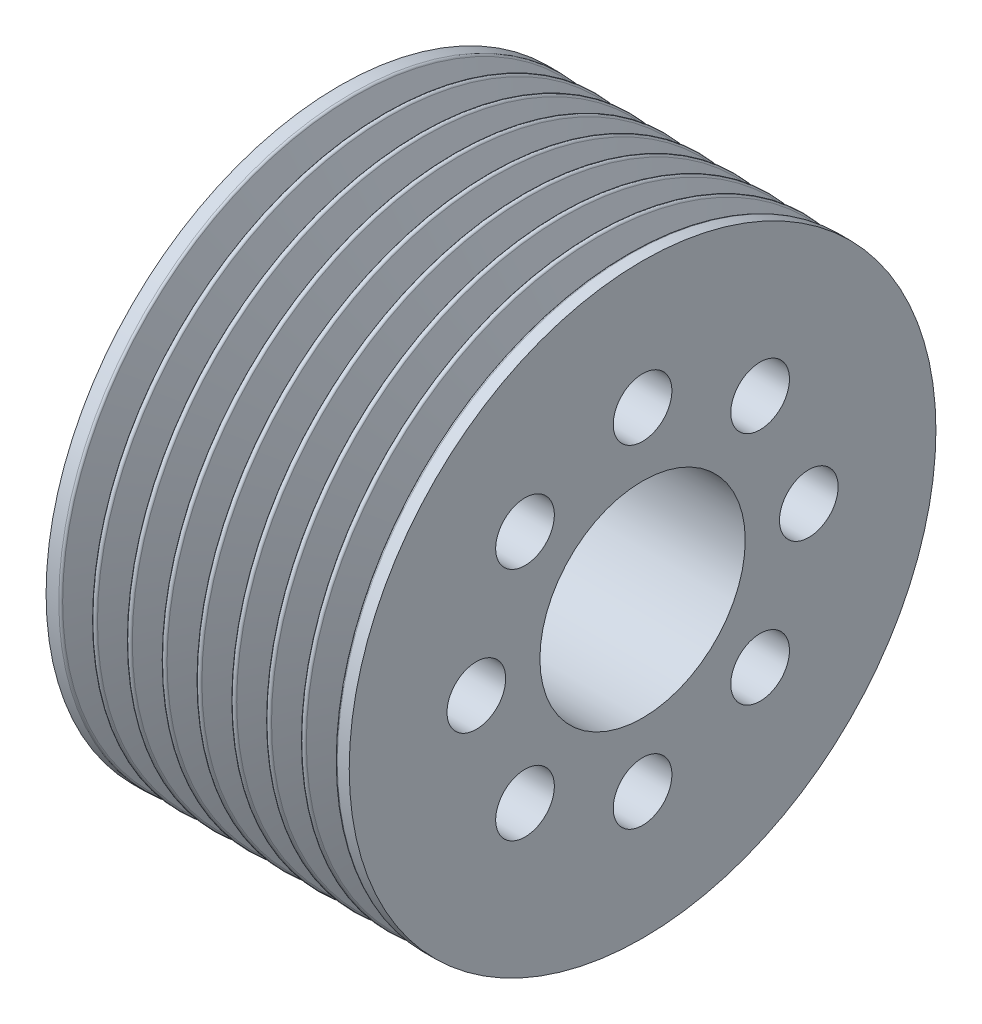
ISO-10303-21;
HEADER;
FILE_DESCRIPTION(('STEP AP214'),'2;1');
FILE_NAME('part.step','',(''),(''),'','','');
FILE_SCHEMA(('AUTOMOTIVE_DESIGN { 1 0 10303 214 1 1 1 1 }'));
ENDSEC;
DATA;
#1=APPLICATION_CONTEXT('core data for automotive mechanical design processes');
#2=APPLICATION_PROTOCOL_DEFINITION('international standard','automotive_design',2000,#1);
#3=PRODUCT_CONTEXT('',#1,'mechanical');
#4=PRODUCT('Part','Part','',(#3));
#5=PRODUCT_RELATED_PRODUCT_CATEGORY('part','',(#4));
#6=PRODUCT_DEFINITION_FORMATION('','',#4);
#7=PRODUCT_DEFINITION_CONTEXT('part definition',#1,'design');
#8=PRODUCT_DEFINITION('design','',#6,#7);
#9=PRODUCT_DEFINITION_SHAPE('','',#8);
#10=(LENGTH_UNIT() NAMED_UNIT(*) SI_UNIT(.MILLI.,.METRE.));
#11=(NAMED_UNIT(*) PLANE_ANGLE_UNIT() SI_UNIT($,.RADIAN.));
#12=(NAMED_UNIT(*) SI_UNIT($,.STERADIAN.) SOLID_ANGLE_UNIT());
#13=UNCERTAINTY_MEASURE_WITH_UNIT(LENGTH_MEASURE(1.E-05),#10,'distance_accuracy_value','');
#14=(GEOMETRIC_REPRESENTATION_CONTEXT(3) GLOBAL_UNCERTAINTY_ASSIGNED_CONTEXT((#13)) GLOBAL_UNIT_ASSIGNED_CONTEXT((#10,
#11,#12)) REPRESENTATION_CONTEXT('',''));
#15=CARTESIAN_POINT('',(0.,0.,0.));
#16=DIRECTION('',(0.,0.,1.));
#17=DIRECTION('',(1.,0.,0.));
#18=AXIS2_PLACEMENT_3D('',#15,#16,#17);
#19=CARTESIAN_POINT('',(0.,0.,0.));
#20=DIRECTION('',(-1.,0.,0.));
#21=DIRECTION('',(0.,0.,1.));
#22=AXIS2_PLACEMENT_3D('',#19,#20,#21);
#23=CYLINDRICAL_SURFACE('',#22,30.);
#24=CARTESIAN_POINT('',(18.,0.,0.));
#25=DIRECTION('',(-1.,0.,0.));
#26=DIRECTION('',(0.,0.,1.));
#27=AXIS2_PLACEMENT_3D('',#24,#25,#26);
#28=CIRCLE('',#27,30.);
#29=CARTESIAN_POINT('',(18.,0.,30.));
#30=VERTEX_POINT('',#29);
#31=EDGE_CURVE('E54',#30,#30,#28,.T.);
#32=ORIENTED_EDGE('',*,*,#31,.F.);
#33=EDGE_LOOP('',(#32));
#34=FACE_BOUND('',#33,.T.);
#35=CARTESIAN_POINT('',(19.3,0.,0.));
#36=DIRECTION('',(-1.,0.,0.));
#37=DIRECTION('',(0.,0.,1.));
#38=AXIS2_PLACEMENT_3D('',#35,#36,#37);
#39=CIRCLE('',#38,30.);
#40=CARTESIAN_POINT('',(19.3,0.,30.));
#41=VERTEX_POINT('',#40);
#42=EDGE_CURVE('E168',#41,#41,#39,.T.);
#43=ORIENTED_EDGE('',*,*,#42,.T.);
#44=EDGE_LOOP('',(#43));
#45=FACE_BOUND('',#44,.T.);
#46=ADVANCED_FACE('F42',(#34,#45),#23,.T.);
#47=CARTESIAN_POINT('',(31.5,10.5,0.));
#48=DIRECTION('',(1.,0.,0.));
#49=DIRECTION('',(0.,0.,-1.));
#50=AXIS2_PLACEMENT_3D('',#47,#48,#49);
#51=PLANE('',#50);
#52=CARTESIAN_POINT('',(31.5,12.0208152801713,12.0208152801713));
#53=DIRECTION('',(1.,0.,0.));
#54=DIRECTION('',(0.,0.,-1.));
#55=AXIS2_PLACEMENT_3D('',#52,#53,#54);
#56=CIRCLE('',#55,3.);
#57=CARTESIAN_POINT('',(31.5,12.0208152801713,9.02081528017131));
#58=VERTEX_POINT('',#57);
#59=EDGE_CURVE('E213',#58,#58,#56,.F.);
#60=ORIENTED_EDGE('',*,*,#59,.F.);
#61=EDGE_LOOP('',(#60));
#62=FACE_BOUND('',#61,.T.);
#63=CARTESIAN_POINT('',(31.5,-12.0208152801713,12.0208152801713));
#64=DIRECTION('',(1.,0.,0.));
#65=DIRECTION('',(0.,0.,-1.));
#66=AXIS2_PLACEMENT_3D('',#63,#64,#65);
#67=CIRCLE('',#66,3.);
#68=CARTESIAN_POINT('',(31.5,-12.0208152801713,9.02081528017133));
#69=VERTEX_POINT('',#68);
#70=EDGE_CURVE('E207',#69,#69,#67,.F.);
#71=ORIENTED_EDGE('',*,*,#70,.F.);
#72=EDGE_LOOP('',(#71));
#73=FACE_BOUND('',#72,.T.);
#74=CARTESIAN_POINT('',(31.5,-17.,-2.47198095326695E-13));
#75=DIRECTION('',(1.,0.,0.));
#76=DIRECTION('',(0.,0.,-1.));
#77=AXIS2_PLACEMENT_3D('',#74,#75,#76);
#78=CIRCLE('',#77,3.);
#79=CARTESIAN_POINT('',(31.5,-17.,-3.00000000000025));
#80=VERTEX_POINT('',#79);
#81=EDGE_CURVE('E201',#80,#80,#78,.F.);
#82=ORIENTED_EDGE('',*,*,#81,.F.);
#83=EDGE_LOOP('',(#82));
#84=FACE_BOUND('',#83,.T.);
#85=CARTESIAN_POINT('',(31.5,-12.020815280171,-12.0208152801716));
#86=DIRECTION('',(1.,0.,0.));
#87=DIRECTION('',(0.,0.,-1.));
#88=AXIS2_PLACEMENT_3D('',#85,#86,#87);
#89=CIRCLE('',#88,3.);
#90=CARTESIAN_POINT('',(31.5,-12.020815280171,-15.0208152801716));
#91=VERTEX_POINT('',#90);
#92=EDGE_CURVE('E195',#91,#91,#89,.F.);
#93=ORIENTED_EDGE('',*,*,#92,.F.);
#94=EDGE_LOOP('',(#93));
#95=FACE_BOUND('',#94,.T.);
#96=CARTESIAN_POINT('',(31.5,0.,-17.));
#97=DIRECTION('',(1.,0.,0.));
#98=DIRECTION('',(0.,0.,-1.));
#99=AXIS2_PLACEMENT_3D('',#96,#97,#98);
#100=CIRCLE('',#99,3.);
#101=CARTESIAN_POINT('',(31.5,0.,-20.));
#102=VERTEX_POINT('',#101);
#103=EDGE_CURVE('E189',#102,#102,#100,.F.);
#104=ORIENTED_EDGE('',*,*,#103,.F.);
#105=EDGE_LOOP('',(#104));
#106=FACE_BOUND('',#105,.T.);
#107=CARTESIAN_POINT('',(31.5,12.0208152801713,-12.0208152801713));
#108=DIRECTION('',(1.,0.,0.));
#109=DIRECTION('',(0.,0.,-1.));
#110=AXIS2_PLACEMENT_3D('',#107,#108,#109);
#111=CIRCLE('',#110,3.);
#112=CARTESIAN_POINT('',(31.5,12.0208152801713,-15.0208152801713));
#113=VERTEX_POINT('',#112);
#114=EDGE_CURVE('E183',#113,#113,#111,.F.);
#115=ORIENTED_EDGE('',*,*,#114,.F.);
#116=EDGE_LOOP('',(#115));
#117=FACE_BOUND('',#116,.T.);
#118=CARTESIAN_POINT('',(31.5,1.72382073893029E-13,17.));
#119=DIRECTION('',(1.,0.,0.));
#120=DIRECTION('',(0.,0.,-1.));
#121=AXIS2_PLACEMENT_3D('',#118,#119,#120);
#122=CIRCLE('',#121,3.);
#123=CARTESIAN_POINT('',(31.5,1.72382073893029E-13,14.));
#124=VERTEX_POINT('',#123);
#125=EDGE_CURVE('E177',#124,#124,#122,.F.);
#126=ORIENTED_EDGE('',*,*,#125,.F.);
#127=EDGE_LOOP('',(#126));
#128=FACE_BOUND('',#127,.T.);
#129=CARTESIAN_POINT('',(31.5,17.,0.));
#130=DIRECTION('',(1.,0.,0.));
#131=DIRECTION('',(0.,0.,-1.));
#132=AXIS2_PLACEMENT_3D('',#129,#130,#131);
#133=CIRCLE('',#132,3.);
#134=CARTESIAN_POINT('',(31.5,17.,-3.));
#135=VERTEX_POINT('',#134);
#136=EDGE_CURVE('E171',#135,#135,#133,.F.);
#137=ORIENTED_EDGE('',*,*,#136,.F.);
#138=EDGE_LOOP('',(#137));
#139=FACE_BOUND('',#138,.T.);
#140=CARTESIAN_POINT('',(31.5,0.,0.));
#141=DIRECTION('',(-1.,0.,0.));
#142=DIRECTION('',(0.,0.,1.));
#143=AXIS2_PLACEMENT_3D('',#140,#141,#142);
#144=CIRCLE('',#143,10.5);
#145=CARTESIAN_POINT('',(31.5,0.,10.5));
#146=VERTEX_POINT('',#145);
#147=EDGE_CURVE('E66',#146,#146,#144,.T.);
#148=ORIENTED_EDGE('',*,*,#147,.F.);
#149=EDGE_LOOP('',(#148));
#150=FACE_BOUND('',#149,.T.);
#151=CARTESIAN_POINT('',(31.5,0.,0.));
#152=DIRECTION('',(-1.,0.,0.));
#153=DIRECTION('',(0.,0.,1.));
#154=AXIS2_PLACEMENT_3D('',#151,#152,#153);
#155=CIRCLE('',#154,21.5);
#156=CARTESIAN_POINT('',(31.5,0.,21.5));
#157=VERTEX_POINT('',#156);
#158=EDGE_CURVE('E10',#157,#157,#155,.T.);
#159=ORIENTED_EDGE('',*,*,#158,.T.);
#160=EDGE_LOOP('',(#159));
#161=FACE_BOUND('',#160,.T.);
#162=ADVANCED_FACE('F45',(#62,#73,#84,#95,#106,#117,#128,#139,#150,#161),#51,.F.);
#163=CARTESIAN_POINT('',(0.,0.,0.));
#164=DIRECTION('',(-1.,0.,0.));
#165=DIRECTION('',(0.,0.,1.));
#166=AXIS2_PLACEMENT_3D('',#163,#164,#165);
#167=CYLINDRICAL_SURFACE('',#166,21.5);
#168=ORIENTED_EDGE('',*,*,#158,.F.);
#169=EDGE_LOOP('',(#168));
#170=FACE_BOUND('',#169,.T.);
#171=CARTESIAN_POINT('',(18.,0.,0.));
#172=DIRECTION('',(-1.,0.,0.));
#173=DIRECTION('',(0.,0.,1.));
#174=AXIS2_PLACEMENT_3D('',#171,#172,#173);
#175=CIRCLE('',#174,21.5);
#176=CARTESIAN_POINT('',(18.,0.,21.5));
#177=VERTEX_POINT('',#176);
#178=EDGE_CURVE('E50',#177,#177,#175,.T.);
#179=ORIENTED_EDGE('',*,*,#178,.T.);
#180=EDGE_LOOP('',(#179));
#181=FACE_BOUND('',#180,.T.);
#182=ADVANCED_FACE('F253',(#170,#181),#167,.F.);
#183=CARTESIAN_POINT('',(18.,30.,0.));
#184=DIRECTION('',(1.,0.,0.));
#185=DIRECTION('',(0.,0.,-1.));
#186=AXIS2_PLACEMENT_3D('',#183,#184,#185);
#187=PLANE('',#186);
#188=ORIENTED_EDGE('',*,*,#178,.F.);
#189=EDGE_LOOP('',(#188));
#190=FACE_BOUND('',#189,.T.);
#191=ORIENTED_EDGE('',*,*,#31,.T.);
#192=EDGE_LOOP('',(#191));
#193=FACE_BOUND('',#192,.T.);
#194=ADVANCED_FACE('F259',(#190,#193),#187,.F.);
#195=CARTESIAN_POINT('',(47.78,0.,0.));
#196=DIRECTION('',(-1.,0.,0.));
#197=DIRECTION('',(0.,0.,1.));
#198=AXIS2_PLACEMENT_3D('',#195,#196,#197);
#199=CIRCLE('',#198,30.);
#200=CARTESIAN_POINT('',(47.78,0.,30.));
#201=VERTEX_POINT('',#200);
#202=EDGE_CURVE('E81',#201,#201,#199,.T.);
#203=ORIENTED_EDGE('',*,*,#202,.F.);
#204=EDGE_LOOP('',(#203));
#205=FACE_BOUND('',#204,.T.);
#206=CARTESIAN_POINT('',(49.,0.,0.));
#207=DIRECTION('',(-1.,0.,0.));
#208=DIRECTION('',(0.,0.,1.));
#209=AXIS2_PLACEMENT_3D('',#206,#207,#208);
#210=CIRCLE('',#209,30.);
#211=CARTESIAN_POINT('',(49.,0.,30.));
#212=VERTEX_POINT('',#211);
#213=EDGE_CURVE('E58',#212,#212,#210,.T.);
#214=ORIENTED_EDGE('',*,*,#213,.T.);
#215=EDGE_LOOP('',(#214));
#216=FACE_BOUND('',#215,.T.);
#217=ADVANCED_FACE('F226',(#205,#216),#23,.T.);
#218=CARTESIAN_POINT('',(49.,10.5,0.));
#219=DIRECTION('',(-1.,0.,0.));
#220=DIRECTION('',(0.,0.,1.));
#221=AXIS2_PLACEMENT_3D('',#218,#219,#220);
#222=PLANE('',#221);
#223=CARTESIAN_POINT('',(49.,12.0208152801713,12.0208152801713));
#224=DIRECTION('',(1.,0.,0.));
#225=DIRECTION('',(0.,0.,-1.));
#226=AXIS2_PLACEMENT_3D('',#223,#224,#225);
#227=CIRCLE('',#226,3.);
#228=CARTESIAN_POINT('',(49.,12.0208152801713,9.02081528017131));
#229=VERTEX_POINT('',#228);
#230=EDGE_CURVE('E216',#229,#229,#227,.T.);
#231=ORIENTED_EDGE('',*,*,#230,.F.);
#232=EDGE_LOOP('',(#231));
#233=FACE_BOUND('',#232,.T.);
#234=CARTESIAN_POINT('',(49.,-12.0208152801713,12.0208152801713));
#235=DIRECTION('',(1.,0.,0.));
#236=DIRECTION('',(0.,0.,-1.));
#237=AXIS2_PLACEMENT_3D('',#234,#235,#236);
#238=CIRCLE('',#237,3.);
#239=CARTESIAN_POINT('',(49.,-12.0208152801713,9.02081528017133));
#240=VERTEX_POINT('',#239);
#241=EDGE_CURVE('E210',#240,#240,#238,.T.);
#242=ORIENTED_EDGE('',*,*,#241,.F.);
#243=EDGE_LOOP('',(#242));
#244=FACE_BOUND('',#243,.T.);
#245=CARTESIAN_POINT('',(49.,-17.,-2.47198095326695E-13));
#246=DIRECTION('',(1.,0.,0.));
#247=DIRECTION('',(0.,0.,-1.));
#248=AXIS2_PLACEMENT_3D('',#245,#246,#247);
#249=CIRCLE('',#248,3.);
#250=CARTESIAN_POINT('',(49.,-17.,-3.00000000000025));
#251=VERTEX_POINT('',#250);
#252=EDGE_CURVE('E204',#251,#251,#249,.T.);
#253=ORIENTED_EDGE('',*,*,#252,.F.);
#254=EDGE_LOOP('',(#253));
#255=FACE_BOUND('',#254,.T.);
#256=CARTESIAN_POINT('',(49.,-12.020815280171,-12.0208152801716));
#257=DIRECTION('',(1.,0.,0.));
#258=DIRECTION('',(0.,0.,-1.));
#259=AXIS2_PLACEMENT_3D('',#256,#257,#258);
#260=CIRCLE('',#259,3.);
#261=CARTESIAN_POINT('',(49.,-12.020815280171,-15.0208152801716));
#262=VERTEX_POINT('',#261);
#263=EDGE_CURVE('E198',#262,#262,#260,.T.);
#264=ORIENTED_EDGE('',*,*,#263,.F.);
#265=EDGE_LOOP('',(#264));
#266=FACE_BOUND('',#265,.T.);
#267=CARTESIAN_POINT('',(49.,0.,-17.));
#268=DIRECTION('',(1.,0.,0.));
#269=DIRECTION('',(0.,0.,-1.));
#270=AXIS2_PLACEMENT_3D('',#267,#268,#269);
#271=CIRCLE('',#270,3.);
#272=CARTESIAN_POINT('',(49.,0.,-20.));
#273=VERTEX_POINT('',#272);
#274=EDGE_CURVE('E192',#273,#273,#271,.T.);
#275=ORIENTED_EDGE('',*,*,#274,.F.);
#276=EDGE_LOOP('',(#275));
#277=FACE_BOUND('',#276,.T.);
#278=CARTESIAN_POINT('',(49.,12.0208152801713,-12.0208152801713));
#279=DIRECTION('',(1.,0.,0.));
#280=DIRECTION('',(0.,0.,-1.));
#281=AXIS2_PLACEMENT_3D('',#278,#279,#280);
#282=CIRCLE('',#281,3.);
#283=CARTESIAN_POINT('',(49.,12.0208152801713,-15.0208152801713));
#284=VERTEX_POINT('',#283);
#285=EDGE_CURVE('E186',#284,#284,#282,.T.);
#286=ORIENTED_EDGE('',*,*,#285,.F.);
#287=EDGE_LOOP('',(#286));
#288=FACE_BOUND('',#287,.T.);
#289=CARTESIAN_POINT('',(49.,1.72382073893029E-13,17.));
#290=DIRECTION('',(1.,0.,0.));
#291=DIRECTION('',(0.,0.,-1.));
#292=AXIS2_PLACEMENT_3D('',#289,#290,#291);
#293=CIRCLE('',#292,3.);
#294=CARTESIAN_POINT('',(49.,1.72382073893029E-13,14.));
#295=VERTEX_POINT('',#294);
#296=EDGE_CURVE('E180',#295,#295,#293,.T.);
#297=ORIENTED_EDGE('',*,*,#296,.F.);
#298=EDGE_LOOP('',(#297));
#299=FACE_BOUND('',#298,.T.);
#300=CARTESIAN_POINT('',(49.,17.,0.));
#301=DIRECTION('',(1.,0.,0.));
#302=DIRECTION('',(0.,0.,-1.));
#303=AXIS2_PLACEMENT_3D('',#300,#301,#302);
#304=CIRCLE('',#303,3.);
#305=CARTESIAN_POINT('',(49.,17.,-3.));
#306=VERTEX_POINT('',#305);
#307=EDGE_CURVE('E174',#306,#306,#304,.T.);
#308=ORIENTED_EDGE('',*,*,#307,.F.);
#309=EDGE_LOOP('',(#308));
#310=FACE_BOUND('',#309,.T.);
#311=ORIENTED_EDGE('',*,*,#213,.F.);
#312=EDGE_LOOP('',(#311));
#313=FACE_BOUND('',#312,.T.);
#314=CARTESIAN_POINT('',(49.,0.,0.));
#315=DIRECTION('',(-1.,0.,0.));
#316=DIRECTION('',(0.,0.,1.));
#317=AXIS2_PLACEMENT_3D('',#314,#315,#316);
#318=CIRCLE('',#317,10.5);
#319=CARTESIAN_POINT('',(49.,0.,10.5));
#320=VERTEX_POINT('',#319);
#321=EDGE_CURVE('E63',#320,#320,#318,.T.);
#322=ORIENTED_EDGE('',*,*,#321,.T.);
#323=EDGE_LOOP('',(#322));
#324=FACE_BOUND('',#323,.T.);
#325=ADVANCED_FACE('F222',(#233,#244,#255,#266,#277,#288,#299,#310,#313,#324),#222,.F.);
#326=CARTESIAN_POINT('',(0.,0.,0.));
#327=DIRECTION('',(-1.,0.,0.));
#328=DIRECTION('',(0.,0.,1.));
#329=AXIS2_PLACEMENT_3D('',#326,#327,#328);
#330=CYLINDRICAL_SURFACE('',#329,10.5);
#331=ORIENTED_EDGE('',*,*,#321,.F.);
#332=EDGE_LOOP('',(#331));
#333=FACE_BOUND('',#332,.T.);
#334=ORIENTED_EDGE('',*,*,#147,.T.);
#335=EDGE_LOOP('',(#334));
#336=FACE_BOUND('',#335,.T.);
#337=ADVANCED_FACE('F225',(#333,#336),#330,.F.);
#338=CARTESIAN_POINT('',(47.78,0.,0.));
#339=DIRECTION('',(-1.,0.,0.));
#340=DIRECTION('',(0.,0.,1.));
#341=AXIS2_PLACEMENT_3D('',#338,#339,#340);
#342=TOROIDAL_SURFACE('',#341,29.75,0.249999999999997);
#343=ORIENTED_EDGE('',*,*,#202,.T.);
#344=EDGE_LOOP('',(#343));
#345=FACE_BOUND('',#344,.T.);
#346=CARTESIAN_POINT('',(47.5458319526879,0.,0.));
#347=DIRECTION('',(-1.,0.,0.));
#348=DIRECTION('',(0.,0.,1.));
#349=AXIS2_PLACEMENT_3D('',#346,#347,#348);
#350=CIRCLE('',#349,29.8375518453149);
#351=CARTESIAN_POINT('',(47.5458319526879,0.,29.8375518453149));
#352=VERTEX_POINT('',#351);
#353=EDGE_CURVE('E69',#352,#352,#350,.T.);
#354=ORIENTED_EDGE('',*,*,#353,.F.);
#355=EDGE_LOOP('',(#354));
#356=FACE_BOUND('',#355,.T.);
#357=ADVANCED_FACE('F248',(#345,#356),#342,.T.);
#358=CARTESIAN_POINT('',(46.2810016567745,0.,0.));
#359=DIRECTION('',(1.,0.,0.));
#360=DIRECTION('',(0.,0.,-1.));
#361=AXIS2_PLACEMENT_3D('',#358,#359,#360);
#362=CONICAL_SURFACE('',#361,26.4546095496951,1.21300383013606);
#363=ORIENTED_EDGE('',*,*,#353,.T.);
#364=EDGE_LOOP('',(#363));
#365=FACE_BOUND('',#364,.T.);
#366=CARTESIAN_POINT('',(46.2810016567745,0.,0.));
#367=DIRECTION('',(-1.,0.,0.));
#368=DIRECTION('',(0.,0.,1.));
#369=AXIS2_PLACEMENT_3D('',#366,#367,#368);
#370=CIRCLE('',#369,26.4546095496951);
#371=CARTESIAN_POINT('',(46.2810016567745,0.,26.4546095496951));
#372=VERTEX_POINT('',#371);
#373=EDGE_CURVE('E72',#372,#372,#370,.T.);
#374=ORIENTED_EDGE('',*,*,#373,.F.);
#375=EDGE_LOOP('',(#374));
#376=FACE_BOUND('',#375,.T.);
#377=ADVANCED_FACE('F449',(#365,#376),#362,.T.);
#378=CARTESIAN_POINT('',(46.,0.,0.));
#379=DIRECTION('',(-1.,0.,0.));
#380=DIRECTION('',(0.,0.,1.));
#381=AXIS2_PLACEMENT_3D('',#378,#379,#380);
#382=TOROIDAL_SURFACE('',#381,26.5596717640729,0.300000000000001);
#383=ORIENTED_EDGE('',*,*,#373,.T.);
#384=EDGE_LOOP('',(#383));
#385=FACE_BOUND('',#384,.T.);
#386=CARTESIAN_POINT('',(45.7189983432255,0.,0.));
#387=DIRECTION('',(-1.,0.,0.));
#388=DIRECTION('',(0.,0.,1.));
#389=AXIS2_PLACEMENT_3D('',#386,#387,#388);
#390=CIRCLE('',#389,26.4546095496951);
#391=CARTESIAN_POINT('',(45.7189983432255,0.,26.4546095496951));
#392=VERTEX_POINT('',#391);
#393=EDGE_CURVE('E75',#392,#392,#390,.T.);
#394=ORIENTED_EDGE('',*,*,#393,.F.);
#395=EDGE_LOOP('',(#394));
#396=FACE_BOUND('',#395,.T.);
#397=ADVANCED_FACE('F444',(#385,#396),#382,.F.);
#398=CARTESIAN_POINT('',(44.4541680473121,0.,0.));
#399=DIRECTION('',(-1.,0.,0.));
#400=DIRECTION('',(0.,0.,1.));
#401=AXIS2_PLACEMENT_3D('',#398,#399,#400);
#402=CONICAL_SURFACE('',#401,29.8375518453149,1.21300383013606);
#403=ORIENTED_EDGE('',*,*,#393,.T.);
#404=EDGE_LOOP('',(#403));
#405=FACE_BOUND('',#404,.T.);
#406=CARTESIAN_POINT('',(44.4541680473121,0.,0.));
#407=DIRECTION('',(-1.,0.,0.));
#408=DIRECTION('',(0.,0.,1.));
#409=AXIS2_PLACEMENT_3D('',#406,#407,#408);
#410=CIRCLE('',#409,29.8375518453149);
#411=CARTESIAN_POINT('',(44.4541680473121,0.,29.8375518453149));
#412=VERTEX_POINT('',#411);
#413=EDGE_CURVE('E78',#412,#412,#410,.T.);
#414=ORIENTED_EDGE('',*,*,#413,.F.);
#415=EDGE_LOOP('',(#414));
#416=FACE_BOUND('',#415,.T.);
#417=ADVANCED_FACE('F439',(#405,#416),#402,.T.);
#418=CARTESIAN_POINT('',(44.22,0.,0.));
#419=DIRECTION('',(-1.,0.,0.));
#420=DIRECTION('',(0.,0.,1.));
#421=AXIS2_PLACEMENT_3D('',#418,#419,#420);
#422=TOROIDAL_SURFACE('',#421,29.75,0.250000000000004);
#423=ORIENTED_EDGE('',*,*,#413,.T.);
#424=EDGE_LOOP('',(#423));
#425=FACE_BOUND('',#424,.T.);
#426=CARTESIAN_POINT('',(43.9858319526879,0.,0.));
#427=DIRECTION('',(-1.,0.,0.));
#428=DIRECTION('',(0.,0.,1.));
#429=AXIS2_PLACEMENT_3D('',#426,#427,#428);
#430=CIRCLE('',#429,29.8375518453149);
#431=CARTESIAN_POINT('',(43.9858319526879,0.,29.8375518453149));
#432=VERTEX_POINT('',#431);
#433=EDGE_CURVE('E84',#432,#432,#430,.T.);
#434=ORIENTED_EDGE('',*,*,#433,.F.);
#435=EDGE_LOOP('',(#434));
#436=FACE_BOUND('',#435,.T.);
#437=ADVANCED_FACE('F434',(#425,#436),#422,.T.);
#438=CARTESIAN_POINT('',(42.7210016567745,0.,0.));
#439=DIRECTION('',(1.,0.,0.));
#440=DIRECTION('',(0.,0.,-1.));
#441=AXIS2_PLACEMENT_3D('',#438,#439,#440);
#442=CONICAL_SURFACE('',#441,26.4546095496951,1.21300383013606);
#443=ORIENTED_EDGE('',*,*,#433,.T.);
#444=EDGE_LOOP('',(#443));
#445=FACE_BOUND('',#444,.T.);
#446=CARTESIAN_POINT('',(42.7210016567745,0.,0.));
#447=DIRECTION('',(-1.,0.,0.));
#448=DIRECTION('',(0.,0.,1.));
#449=AXIS2_PLACEMENT_3D('',#446,#447,#448);
#450=CIRCLE('',#449,26.4546095496951);
#451=CARTESIAN_POINT('',(42.7210016567745,0.,26.4546095496951));
#452=VERTEX_POINT('',#451);
#453=EDGE_CURVE('E87',#452,#452,#450,.T.);
#454=ORIENTED_EDGE('',*,*,#453,.F.);
#455=EDGE_LOOP('',(#454));
#456=FACE_BOUND('',#455,.T.);
#457=ADVANCED_FACE('F429',(#445,#456),#442,.T.);
#458=CARTESIAN_POINT('',(42.44,0.,0.));
#459=DIRECTION('',(-1.,0.,0.));
#460=DIRECTION('',(0.,0.,1.));
#461=AXIS2_PLACEMENT_3D('',#458,#459,#460);
#462=TOROIDAL_SURFACE('',#461,26.5596717640729,0.300000000000001);
#463=ORIENTED_EDGE('',*,*,#453,.T.);
#464=EDGE_LOOP('',(#463));
#465=FACE_BOUND('',#464,.T.);
#466=CARTESIAN_POINT('',(42.1589983432255,0.,0.));
#467=DIRECTION('',(-1.,0.,0.));
#468=DIRECTION('',(0.,0.,1.));
#469=AXIS2_PLACEMENT_3D('',#466,#467,#468);
#470=CIRCLE('',#469,26.4546095496951);
#471=CARTESIAN_POINT('',(42.1589983432255,0.,26.4546095496951));
#472=VERTEX_POINT('',#471);
#473=EDGE_CURVE('E90',#472,#472,#470,.T.);
#474=ORIENTED_EDGE('',*,*,#473,.F.);
#475=EDGE_LOOP('',(#474));
#476=FACE_BOUND('',#475,.T.);
#477=ADVANCED_FACE('F424',(#465,#476),#462,.F.);
#478=CARTESIAN_POINT('',(40.8941680473121,0.,0.));
#479=DIRECTION('',(-1.,0.,0.));
#480=DIRECTION('',(0.,0.,1.));
#481=AXIS2_PLACEMENT_3D('',#478,#479,#480);
#482=CONICAL_SURFACE('',#481,29.8375518453149,1.21300383013606);
#483=ORIENTED_EDGE('',*,*,#473,.T.);
#484=EDGE_LOOP('',(#483));
#485=FACE_BOUND('',#484,.T.);
#486=CARTESIAN_POINT('',(40.8941680473121,0.,0.));
#487=DIRECTION('',(-1.,0.,0.));
#488=DIRECTION('',(0.,0.,1.));
#489=AXIS2_PLACEMENT_3D('',#486,#487,#488);
#490=CIRCLE('',#489,29.8375518453149);
#491=CARTESIAN_POINT('',(40.8941680473121,0.,29.8375518453149));
#492=VERTEX_POINT('',#491);
#493=EDGE_CURVE('E93',#492,#492,#490,.T.);
#494=ORIENTED_EDGE('',*,*,#493,.F.);
#495=EDGE_LOOP('',(#494));
#496=FACE_BOUND('',#495,.T.);
#497=ADVANCED_FACE('F419',(#485,#496),#482,.T.);
#498=CARTESIAN_POINT('',(40.66,0.,0.));
#499=DIRECTION('',(-1.,0.,0.));
#500=DIRECTION('',(0.,0.,1.));
#501=AXIS2_PLACEMENT_3D('',#498,#499,#500);
#502=TOROIDAL_SURFACE('',#501,29.75,0.250000000000004);
#503=ORIENTED_EDGE('',*,*,#493,.T.);
#504=EDGE_LOOP('',(#503));
#505=FACE_BOUND('',#504,.T.);
#506=CARTESIAN_POINT('',(40.4258319526879,0.,0.));
#507=DIRECTION('',(-1.,0.,0.));
#508=DIRECTION('',(0.,0.,1.));
#509=AXIS2_PLACEMENT_3D('',#506,#507,#508);
#510=CIRCLE('',#509,29.8375518453149);
#511=CARTESIAN_POINT('',(40.4258319526879,0.,29.8375518453149));
#512=VERTEX_POINT('',#511);
#513=EDGE_CURVE('E96',#512,#512,#510,.T.);
#514=ORIENTED_EDGE('',*,*,#513,.F.);
#515=EDGE_LOOP('',(#514));
#516=FACE_BOUND('',#515,.T.);
#517=ADVANCED_FACE('F414',(#505,#516),#502,.T.);
#518=CARTESIAN_POINT('',(39.1610016567745,0.,0.));
#519=DIRECTION('',(1.,0.,0.));
#520=DIRECTION('',(0.,0.,-1.));
#521=AXIS2_PLACEMENT_3D('',#518,#519,#520);
#522=CONICAL_SURFACE('',#521,26.4546095496951,1.21300383013606);
#523=ORIENTED_EDGE('',*,*,#513,.T.);
#524=EDGE_LOOP('',(#523));
#525=FACE_BOUND('',#524,.T.);
#526=CARTESIAN_POINT('',(39.1610016567745,0.,0.));
#527=DIRECTION('',(-1.,0.,0.));
#528=DIRECTION('',(0.,0.,1.));
#529=AXIS2_PLACEMENT_3D('',#526,#527,#528);
#530=CIRCLE('',#529,26.4546095496951);
#531=CARTESIAN_POINT('',(39.1610016567745,0.,26.4546095496951));
#532=VERTEX_POINT('',#531);
#533=EDGE_CURVE('E99',#532,#532,#530,.T.);
#534=ORIENTED_EDGE('',*,*,#533,.F.);
#535=EDGE_LOOP('',(#534));
#536=FACE_BOUND('',#535,.T.);
#537=ADVANCED_FACE('F409',(#525,#536),#522,.T.);
#538=CARTESIAN_POINT('',(38.88,0.,0.));
#539=DIRECTION('',(-1.,0.,0.));
#540=DIRECTION('',(0.,0.,1.));
#541=AXIS2_PLACEMENT_3D('',#538,#539,#540);
#542=TOROIDAL_SURFACE('',#541,26.5596717640729,0.300000000000001);
#543=ORIENTED_EDGE('',*,*,#533,.T.);
#544=EDGE_LOOP('',(#543));
#545=FACE_BOUND('',#544,.T.);
#546=CARTESIAN_POINT('',(38.5989983432255,0.,0.));
#547=DIRECTION('',(-1.,0.,0.));
#548=DIRECTION('',(0.,0.,1.));
#549=AXIS2_PLACEMENT_3D('',#546,#547,#548);
#550=CIRCLE('',#549,26.4546095496951);
#551=CARTESIAN_POINT('',(38.5989983432255,0.,26.4546095496951));
#552=VERTEX_POINT('',#551);
#553=EDGE_CURVE('E102',#552,#552,#550,.T.);
#554=ORIENTED_EDGE('',*,*,#553,.F.);
#555=EDGE_LOOP('',(#554));
#556=FACE_BOUND('',#555,.T.);
#557=ADVANCED_FACE('F404',(#545,#556),#542,.F.);
#558=CARTESIAN_POINT('',(37.3341680473121,0.,0.));
#559=DIRECTION('',(-1.,0.,0.));
#560=DIRECTION('',(0.,0.,1.));
#561=AXIS2_PLACEMENT_3D('',#558,#559,#560);
#562=CONICAL_SURFACE('',#561,29.8375518453149,1.21300383013606);
#563=ORIENTED_EDGE('',*,*,#553,.T.);
#564=EDGE_LOOP('',(#563));
#565=FACE_BOUND('',#564,.T.);
#566=CARTESIAN_POINT('',(37.3341680473121,0.,0.));
#567=DIRECTION('',(-1.,0.,0.));
#568=DIRECTION('',(0.,0.,1.));
#569=AXIS2_PLACEMENT_3D('',#566,#567,#568);
#570=CIRCLE('',#569,29.8375518453149);
#571=CARTESIAN_POINT('',(37.3341680473121,0.,29.8375518453149));
#572=VERTEX_POINT('',#571);
#573=EDGE_CURVE('E105',#572,#572,#570,.T.);
#574=ORIENTED_EDGE('',*,*,#573,.F.);
#575=EDGE_LOOP('',(#574));
#576=FACE_BOUND('',#575,.T.);
#577=ADVANCED_FACE('F399',(#565,#576),#562,.T.);
#578=CARTESIAN_POINT('',(37.1,0.,0.));
#579=DIRECTION('',(-1.,0.,0.));
#580=DIRECTION('',(0.,0.,1.));
#581=AXIS2_PLACEMENT_3D('',#578,#579,#580);
#582=TOROIDAL_SURFACE('',#581,29.75,0.250000000000004);
#583=ORIENTED_EDGE('',*,*,#573,.T.);
#584=EDGE_LOOP('',(#583));
#585=FACE_BOUND('',#584,.T.);
#586=CARTESIAN_POINT('',(36.8658319526879,0.,0.));
#587=DIRECTION('',(-1.,0.,0.));
#588=DIRECTION('',(0.,0.,1.));
#589=AXIS2_PLACEMENT_3D('',#586,#587,#588);
#590=CIRCLE('',#589,29.8375518453149);
#591=CARTESIAN_POINT('',(36.8658319526879,0.,29.8375518453149));
#592=VERTEX_POINT('',#591);
#593=EDGE_CURVE('E108',#592,#592,#590,.T.);
#594=ORIENTED_EDGE('',*,*,#593,.F.);
#595=EDGE_LOOP('',(#594));
#596=FACE_BOUND('',#595,.T.);
#597=ADVANCED_FACE('F394',(#585,#596),#582,.T.);
#598=CARTESIAN_POINT('',(35.6010016567745,0.,0.));
#599=DIRECTION('',(1.,0.,0.));
#600=DIRECTION('',(0.,0.,-1.));
#601=AXIS2_PLACEMENT_3D('',#598,#599,#600);
#602=CONICAL_SURFACE('',#601,26.4546095496951,1.21300383013606);
#603=ORIENTED_EDGE('',*,*,#593,.T.);
#604=EDGE_LOOP('',(#603));
#605=FACE_BOUND('',#604,.T.);
#606=CARTESIAN_POINT('',(35.6010016567745,0.,0.));
#607=DIRECTION('',(-1.,0.,0.));
#608=DIRECTION('',(0.,0.,1.));
#609=AXIS2_PLACEMENT_3D('',#606,#607,#608);
#610=CIRCLE('',#609,26.4546095496951);
#611=CARTESIAN_POINT('',(35.6010016567745,0.,26.4546095496951));
#612=VERTEX_POINT('',#611);
#613=EDGE_CURVE('E111',#612,#612,#610,.T.);
#614=ORIENTED_EDGE('',*,*,#613,.F.);
#615=EDGE_LOOP('',(#614));
#616=FACE_BOUND('',#615,.T.);
#617=ADVANCED_FACE('F389',(#605,#616),#602,.T.);
#618=CARTESIAN_POINT('',(35.32,0.,0.));
#619=DIRECTION('',(-1.,0.,0.));
#620=DIRECTION('',(0.,0.,1.));
#621=AXIS2_PLACEMENT_3D('',#618,#619,#620);
#622=TOROIDAL_SURFACE('',#621,26.5596717640729,0.300000000000001);
#623=ORIENTED_EDGE('',*,*,#613,.T.);
#624=EDGE_LOOP('',(#623));
#625=FACE_BOUND('',#624,.T.);
#626=CARTESIAN_POINT('',(35.0389983432255,0.,0.));
#627=DIRECTION('',(-1.,0.,0.));
#628=DIRECTION('',(0.,0.,1.));
#629=AXIS2_PLACEMENT_3D('',#626,#627,#628);
#630=CIRCLE('',#629,26.4546095496951);
#631=CARTESIAN_POINT('',(35.0389983432255,0.,26.4546095496951));
#632=VERTEX_POINT('',#631);
#633=EDGE_CURVE('E114',#632,#632,#630,.T.);
#634=ORIENTED_EDGE('',*,*,#633,.F.);
#635=EDGE_LOOP('',(#634));
#636=FACE_BOUND('',#635,.T.);
#637=ADVANCED_FACE('F384',(#625,#636),#622,.F.);
#638=CARTESIAN_POINT('',(33.7741680473121,0.,0.));
#639=DIRECTION('',(-1.,0.,0.));
#640=DIRECTION('',(0.,0.,1.));
#641=AXIS2_PLACEMENT_3D('',#638,#639,#640);
#642=CONICAL_SURFACE('',#641,29.8375518453149,1.21300383013606);
#643=ORIENTED_EDGE('',*,*,#633,.T.);
#644=EDGE_LOOP('',(#643));
#645=FACE_BOUND('',#644,.T.);
#646=CARTESIAN_POINT('',(33.7741680473121,0.,0.));
#647=DIRECTION('',(-1.,0.,0.));
#648=DIRECTION('',(0.,0.,1.));
#649=AXIS2_PLACEMENT_3D('',#646,#647,#648);
#650=CIRCLE('',#649,29.8375518453149);
#651=CARTESIAN_POINT('',(33.7741680473121,0.,29.8375518453149));
#652=VERTEX_POINT('',#651);
#653=EDGE_CURVE('E117',#652,#652,#650,.T.);
#654=ORIENTED_EDGE('',*,*,#653,.F.);
#655=EDGE_LOOP('',(#654));
#656=FACE_BOUND('',#655,.T.);
#657=ADVANCED_FACE('F379',(#645,#656),#642,.T.);
#658=CARTESIAN_POINT('',(33.54,0.,0.));
#659=DIRECTION('',(-1.,0.,0.));
#660=DIRECTION('',(0.,0.,1.));
#661=AXIS2_PLACEMENT_3D('',#658,#659,#660);
#662=TOROIDAL_SURFACE('',#661,29.75,0.250000000000004);
#663=ORIENTED_EDGE('',*,*,#653,.T.);
#664=EDGE_LOOP('',(#663));
#665=FACE_BOUND('',#664,.T.);
#666=CARTESIAN_POINT('',(33.3058319526879,0.,0.));
#667=DIRECTION('',(-1.,0.,0.));
#668=DIRECTION('',(0.,0.,1.));
#669=AXIS2_PLACEMENT_3D('',#666,#667,#668);
#670=CIRCLE('',#669,29.8375518453149);
#671=CARTESIAN_POINT('',(33.3058319526879,0.,29.8375518453149));
#672=VERTEX_POINT('',#671);
#673=EDGE_CURVE('E120',#672,#672,#670,.T.);
#674=ORIENTED_EDGE('',*,*,#673,.F.);
#675=EDGE_LOOP('',(#674));
#676=FACE_BOUND('',#675,.T.);
#677=ADVANCED_FACE('F374',(#665,#676),#662,.T.);
#678=CARTESIAN_POINT('',(32.0410016567745,0.,0.));
#679=DIRECTION('',(1.,0.,0.));
#680=DIRECTION('',(0.,0.,-1.));
#681=AXIS2_PLACEMENT_3D('',#678,#679,#680);
#682=CONICAL_SURFACE('',#681,26.4546095496951,1.21300383013606);
#683=ORIENTED_EDGE('',*,*,#673,.T.);
#684=EDGE_LOOP('',(#683));
#685=FACE_BOUND('',#684,.T.);
#686=CARTESIAN_POINT('',(32.0410016567745,0.,0.));
#687=DIRECTION('',(-1.,0.,0.));
#688=DIRECTION('',(0.,0.,1.));
#689=AXIS2_PLACEMENT_3D('',#686,#687,#688);
#690=CIRCLE('',#689,26.4546095496951);
#691=CARTESIAN_POINT('',(32.0410016567745,0.,26.4546095496951));
#692=VERTEX_POINT('',#691);
#693=EDGE_CURVE('E123',#692,#692,#690,.T.);
#694=ORIENTED_EDGE('',*,*,#693,.F.);
#695=EDGE_LOOP('',(#694));
#696=FACE_BOUND('',#695,.T.);
#697=ADVANCED_FACE('F369',(#685,#696),#682,.T.);
#698=CARTESIAN_POINT('',(31.76,0.,0.));
#699=DIRECTION('',(-1.,0.,0.));
#700=DIRECTION('',(0.,0.,1.));
#701=AXIS2_PLACEMENT_3D('',#698,#699,#700);
#702=TOROIDAL_SURFACE('',#701,26.5596717640729,0.300000000000001);
#703=ORIENTED_EDGE('',*,*,#693,.T.);
#704=EDGE_LOOP('',(#703));
#705=FACE_BOUND('',#704,.T.);
#706=CARTESIAN_POINT('',(31.4789983432255,0.,0.));
#707=DIRECTION('',(-1.,0.,0.));
#708=DIRECTION('',(0.,0.,1.));
#709=AXIS2_PLACEMENT_3D('',#706,#707,#708);
#710=CIRCLE('',#709,26.4546095496951);
#711=CARTESIAN_POINT('',(31.4789983432255,0.,26.4546095496951));
#712=VERTEX_POINT('',#711);
#713=EDGE_CURVE('E126',#712,#712,#710,.T.);
#714=ORIENTED_EDGE('',*,*,#713,.F.);
#715=EDGE_LOOP('',(#714));
#716=FACE_BOUND('',#715,.T.);
#717=ADVANCED_FACE('F364',(#705,#716),#702,.F.);
#718=CARTESIAN_POINT('',(30.2141680473121,0.,0.));
#719=DIRECTION('',(-1.,0.,0.));
#720=DIRECTION('',(0.,0.,1.));
#721=AXIS2_PLACEMENT_3D('',#718,#719,#720);
#722=CONICAL_SURFACE('',#721,29.8375518453149,1.21300383013606);
#723=ORIENTED_EDGE('',*,*,#713,.T.);
#724=EDGE_LOOP('',(#723));
#725=FACE_BOUND('',#724,.T.);
#726=CARTESIAN_POINT('',(30.2141680473121,0.,0.));
#727=DIRECTION('',(-1.,0.,0.));
#728=DIRECTION('',(0.,0.,1.));
#729=AXIS2_PLACEMENT_3D('',#726,#727,#728);
#730=CIRCLE('',#729,29.8375518453149);
#731=CARTESIAN_POINT('',(30.2141680473121,0.,29.8375518453149));
#732=VERTEX_POINT('',#731);
#733=EDGE_CURVE('E129',#732,#732,#730,.T.);
#734=ORIENTED_EDGE('',*,*,#733,.F.);
#735=EDGE_LOOP('',(#734));
#736=FACE_BOUND('',#735,.T.);
#737=ADVANCED_FACE('F359',(#725,#736),#722,.T.);
#738=CARTESIAN_POINT('',(29.98,0.,0.));
#739=DIRECTION('',(-1.,0.,0.));
#740=DIRECTION('',(0.,0.,1.));
#741=AXIS2_PLACEMENT_3D('',#738,#739,#740);
#742=TOROIDAL_SURFACE('',#741,29.75,0.250000000000004);
#743=ORIENTED_EDGE('',*,*,#733,.T.);
#744=EDGE_LOOP('',(#743));
#745=FACE_BOUND('',#744,.T.);
#746=CARTESIAN_POINT('',(29.7458319526879,0.,0.));
#747=DIRECTION('',(-1.,0.,0.));
#748=DIRECTION('',(0.,0.,1.));
#749=AXIS2_PLACEMENT_3D('',#746,#747,#748);
#750=CIRCLE('',#749,29.8375518453149);
#751=CARTESIAN_POINT('',(29.7458319526879,0.,29.8375518453149));
#752=VERTEX_POINT('',#751);
#753=EDGE_CURVE('E132',#752,#752,#750,.T.);
#754=ORIENTED_EDGE('',*,*,#753,.F.);
#755=EDGE_LOOP('',(#754));
#756=FACE_BOUND('',#755,.T.);
#757=ADVANCED_FACE('F354',(#745,#756),#742,.T.);
#758=CARTESIAN_POINT('',(28.4810016567745,0.,0.));
#759=DIRECTION('',(1.,0.,0.));
#760=DIRECTION('',(0.,0.,-1.));
#761=AXIS2_PLACEMENT_3D('',#758,#759,#760);
#762=CONICAL_SURFACE('',#761,26.4546095496951,1.21300383013606);
#763=ORIENTED_EDGE('',*,*,#753,.T.);
#764=EDGE_LOOP('',(#763));
#765=FACE_BOUND('',#764,.T.);
#766=CARTESIAN_POINT('',(28.4810016567745,0.,0.));
#767=DIRECTION('',(-1.,0.,0.));
#768=DIRECTION('',(0.,0.,1.));
#769=AXIS2_PLACEMENT_3D('',#766,#767,#768);
#770=CIRCLE('',#769,26.4546095496951);
#771=CARTESIAN_POINT('',(28.4810016567745,0.,26.4546095496951));
#772=VERTEX_POINT('',#771);
#773=EDGE_CURVE('E135',#772,#772,#770,.T.);
#774=ORIENTED_EDGE('',*,*,#773,.F.);
#775=EDGE_LOOP('',(#774));
#776=FACE_BOUND('',#775,.T.);
#777=ADVANCED_FACE('F349',(#765,#776),#762,.T.);
#778=CARTESIAN_POINT('',(28.2,0.,0.));
#779=DIRECTION('',(-1.,0.,0.));
#780=DIRECTION('',(0.,0.,1.));
#781=AXIS2_PLACEMENT_3D('',#778,#779,#780);
#782=TOROIDAL_SURFACE('',#781,26.5596717640729,0.300000000000001);
#783=ORIENTED_EDGE('',*,*,#773,.T.);
#784=EDGE_LOOP('',(#783));
#785=FACE_BOUND('',#784,.T.);
#786=CARTESIAN_POINT('',(27.9189983432255,0.,0.));
#787=DIRECTION('',(-1.,0.,0.));
#788=DIRECTION('',(0.,0.,1.));
#789=AXIS2_PLACEMENT_3D('',#786,#787,#788);
#790=CIRCLE('',#789,26.4546095496951);
#791=CARTESIAN_POINT('',(27.9189983432255,0.,26.4546095496951));
#792=VERTEX_POINT('',#791);
#793=EDGE_CURVE('E138',#792,#792,#790,.T.);
#794=ORIENTED_EDGE('',*,*,#793,.F.);
#795=EDGE_LOOP('',(#794));
#796=FACE_BOUND('',#795,.T.);
#797=ADVANCED_FACE('F344',(#785,#796),#782,.F.);
#798=CARTESIAN_POINT('',(26.6541680473121,0.,0.));
#799=DIRECTION('',(-1.,0.,0.));
#800=DIRECTION('',(0.,0.,1.));
#801=AXIS2_PLACEMENT_3D('',#798,#799,#800);
#802=CONICAL_SURFACE('',#801,29.8375518453149,1.21300383013606);
#803=ORIENTED_EDGE('',*,*,#793,.T.);
#804=EDGE_LOOP('',(#803));
#805=FACE_BOUND('',#804,.T.);
#806=CARTESIAN_POINT('',(26.6541680473121,0.,0.));
#807=DIRECTION('',(-1.,0.,0.));
#808=DIRECTION('',(0.,0.,1.));
#809=AXIS2_PLACEMENT_3D('',#806,#807,#808);
#810=CIRCLE('',#809,29.8375518453149);
#811=CARTESIAN_POINT('',(26.6541680473121,0.,29.8375518453149));
#812=VERTEX_POINT('',#811);
#813=EDGE_CURVE('E141',#812,#812,#810,.T.);
#814=ORIENTED_EDGE('',*,*,#813,.F.);
#815=EDGE_LOOP('',(#814));
#816=FACE_BOUND('',#815,.T.);
#817=ADVANCED_FACE('F339',(#805,#816),#802,.T.);
#818=CARTESIAN_POINT('',(26.42,0.,0.));
#819=DIRECTION('',(-1.,0.,0.));
#820=DIRECTION('',(0.,0.,1.));
#821=AXIS2_PLACEMENT_3D('',#818,#819,#820);
#822=TOROIDAL_SURFACE('',#821,29.75,0.250000000000004);
#823=ORIENTED_EDGE('',*,*,#813,.T.);
#824=EDGE_LOOP('',(#823));
#825=FACE_BOUND('',#824,.T.);
#826=CARTESIAN_POINT('',(26.1858319526879,0.,0.));
#827=DIRECTION('',(-1.,0.,0.));
#828=DIRECTION('',(0.,0.,1.));
#829=AXIS2_PLACEMENT_3D('',#826,#827,#828);
#830=CIRCLE('',#829,29.8375518453149);
#831=CARTESIAN_POINT('',(26.1858319526879,0.,29.8375518453149));
#832=VERTEX_POINT('',#831);
#833=EDGE_CURVE('E144',#832,#832,#830,.T.);
#834=ORIENTED_EDGE('',*,*,#833,.F.);
#835=EDGE_LOOP('',(#834));
#836=FACE_BOUND('',#835,.T.);
#837=ADVANCED_FACE('F334',(#825,#836),#822,.T.);
#838=CARTESIAN_POINT('',(24.9210016567745,0.,0.));
#839=DIRECTION('',(1.,0.,0.));
#840=DIRECTION('',(0.,0.,-1.));
#841=AXIS2_PLACEMENT_3D('',#838,#839,#840);
#842=CONICAL_SURFACE('',#841,26.4546095496951,1.21300383013606);
#843=ORIENTED_EDGE('',*,*,#833,.T.);
#844=EDGE_LOOP('',(#843));
#845=FACE_BOUND('',#844,.T.);
#846=CARTESIAN_POINT('',(24.9210016567745,0.,0.));
#847=DIRECTION('',(-1.,0.,0.));
#848=DIRECTION('',(0.,0.,1.));
#849=AXIS2_PLACEMENT_3D('',#846,#847,#848);
#850=CIRCLE('',#849,26.4546095496951);
#851=CARTESIAN_POINT('',(24.9210016567745,0.,26.4546095496951));
#852=VERTEX_POINT('',#851);
#853=EDGE_CURVE('E147',#852,#852,#850,.T.);
#854=ORIENTED_EDGE('',*,*,#853,.F.);
#855=EDGE_LOOP('',(#854));
#856=FACE_BOUND('',#855,.T.);
#857=ADVANCED_FACE('F329',(#845,#856),#842,.T.);
#858=CARTESIAN_POINT('',(24.64,0.,0.));
#859=DIRECTION('',(-1.,0.,0.));
#860=DIRECTION('',(0.,0.,1.));
#861=AXIS2_PLACEMENT_3D('',#858,#859,#860);
#862=TOROIDAL_SURFACE('',#861,26.5596717640729,0.300000000000001);
#863=ORIENTED_EDGE('',*,*,#853,.T.);
#864=EDGE_LOOP('',(#863));
#865=FACE_BOUND('',#864,.T.);
#866=CARTESIAN_POINT('',(24.3589983432255,0.,0.));
#867=DIRECTION('',(-1.,0.,0.));
#868=DIRECTION('',(0.,0.,1.));
#869=AXIS2_PLACEMENT_3D('',#866,#867,#868);
#870=CIRCLE('',#869,26.4546095496951);
#871=CARTESIAN_POINT('',(24.3589983432255,0.,26.4546095496951));
#872=VERTEX_POINT('',#871);
#873=EDGE_CURVE('E150',#872,#872,#870,.T.);
#874=ORIENTED_EDGE('',*,*,#873,.F.);
#875=EDGE_LOOP('',(#874));
#876=FACE_BOUND('',#875,.T.);
#877=ADVANCED_FACE('F324',(#865,#876),#862,.F.);
#878=CARTESIAN_POINT('',(23.0941680473121,0.,0.));
#879=DIRECTION('',(-1.,0.,0.));
#880=DIRECTION('',(0.,0.,1.));
#881=AXIS2_PLACEMENT_3D('',#878,#879,#880);
#882=CONICAL_SURFACE('',#881,29.8375518453149,1.21300383013606);
#883=ORIENTED_EDGE('',*,*,#873,.T.);
#884=EDGE_LOOP('',(#883));
#885=FACE_BOUND('',#884,.T.);
#886=CARTESIAN_POINT('',(23.0941680473121,0.,0.));
#887=DIRECTION('',(-1.,0.,0.));
#888=DIRECTION('',(0.,0.,1.));
#889=AXIS2_PLACEMENT_3D('',#886,#887,#888);
#890=CIRCLE('',#889,29.8375518453149);
#891=CARTESIAN_POINT('',(23.0941680473121,0.,29.8375518453149));
#892=VERTEX_POINT('',#891);
#893=EDGE_CURVE('E153',#892,#892,#890,.T.);
#894=ORIENTED_EDGE('',*,*,#893,.F.);
#895=EDGE_LOOP('',(#894));
#896=FACE_BOUND('',#895,.T.);
#897=ADVANCED_FACE('F319',(#885,#896),#882,.T.);
#898=CARTESIAN_POINT('',(22.86,0.,0.));
#899=DIRECTION('',(-1.,0.,0.));
#900=DIRECTION('',(0.,0.,1.));
#901=AXIS2_PLACEMENT_3D('',#898,#899,#900);
#902=TOROIDAL_SURFACE('',#901,29.75,0.250000000000004);
#903=ORIENTED_EDGE('',*,*,#893,.T.);
#904=EDGE_LOOP('',(#903));
#905=FACE_BOUND('',#904,.T.);
#906=CARTESIAN_POINT('',(22.6258319526879,0.,0.));
#907=DIRECTION('',(-1.,0.,0.));
#908=DIRECTION('',(0.,0.,1.));
#909=AXIS2_PLACEMENT_3D('',#906,#907,#908);
#910=CIRCLE('',#909,29.8375518453149);
#911=CARTESIAN_POINT('',(22.6258319526879,0.,29.8375518453149));
#912=VERTEX_POINT('',#911);
#913=EDGE_CURVE('E156',#912,#912,#910,.T.);
#914=ORIENTED_EDGE('',*,*,#913,.F.);
#915=EDGE_LOOP('',(#914));
#916=FACE_BOUND('',#915,.T.);
#917=ADVANCED_FACE('F314',(#905,#916),#902,.T.);
#918=CARTESIAN_POINT('',(21.3610016567745,0.,0.));
#919=DIRECTION('',(1.,0.,0.));
#920=DIRECTION('',(0.,0.,-1.));
#921=AXIS2_PLACEMENT_3D('',#918,#919,#920);
#922=CONICAL_SURFACE('',#921,26.4546095496951,1.21300383013606);
#923=ORIENTED_EDGE('',*,*,#913,.T.);
#924=EDGE_LOOP('',(#923));
#925=FACE_BOUND('',#924,.T.);
#926=CARTESIAN_POINT('',(21.3610016567745,0.,0.));
#927=DIRECTION('',(-1.,0.,0.));
#928=DIRECTION('',(0.,0.,1.));
#929=AXIS2_PLACEMENT_3D('',#926,#927,#928);
#930=CIRCLE('',#929,26.4546095496951);
#931=CARTESIAN_POINT('',(21.3610016567745,0.,26.4546095496951));
#932=VERTEX_POINT('',#931);
#933=EDGE_CURVE('E159',#932,#932,#930,.T.);
#934=ORIENTED_EDGE('',*,*,#933,.F.);
#935=EDGE_LOOP('',(#934));
#936=FACE_BOUND('',#935,.T.);
#937=ADVANCED_FACE('F309',(#925,#936),#922,.T.);
#938=CARTESIAN_POINT('',(21.08,0.,0.));
#939=DIRECTION('',(-1.,0.,0.));
#940=DIRECTION('',(0.,0.,1.));
#941=AXIS2_PLACEMENT_3D('',#938,#939,#940);
#942=TOROIDAL_SURFACE('',#941,26.5596717640729,0.300000000000001);
#943=ORIENTED_EDGE('',*,*,#933,.T.);
#944=EDGE_LOOP('',(#943));
#945=FACE_BOUND('',#944,.T.);
#946=CARTESIAN_POINT('',(20.7989983432255,0.,0.));
#947=DIRECTION('',(-1.,0.,0.));
#948=DIRECTION('',(0.,0.,1.));
#949=AXIS2_PLACEMENT_3D('',#946,#947,#948);
#950=CIRCLE('',#949,26.4546095496951);
#951=CARTESIAN_POINT('',(20.7989983432255,0.,26.4546095496951));
#952=VERTEX_POINT('',#951);
#953=EDGE_CURVE('E162',#952,#952,#950,.T.);
#954=ORIENTED_EDGE('',*,*,#953,.F.);
#955=EDGE_LOOP('',(#954));
#956=FACE_BOUND('',#955,.T.);
#957=ADVANCED_FACE('F304',(#945,#956),#942,.F.);
#958=CARTESIAN_POINT('',(19.5341680473121,0.,0.));
#959=DIRECTION('',(-1.,0.,0.));
#960=DIRECTION('',(0.,0.,1.));
#961=AXIS2_PLACEMENT_3D('',#958,#959,#960);
#962=CONICAL_SURFACE('',#961,29.8375518453149,1.21300383013606);
#963=ORIENTED_EDGE('',*,*,#953,.T.);
#964=EDGE_LOOP('',(#963));
#965=FACE_BOUND('',#964,.T.);
#966=CARTESIAN_POINT('',(19.5341680473121,0.,0.));
#967=DIRECTION('',(-1.,0.,0.));
#968=DIRECTION('',(0.,0.,1.));
#969=AXIS2_PLACEMENT_3D('',#966,#967,#968);
#970=CIRCLE('',#969,29.8375518453149);
#971=CARTESIAN_POINT('',(19.5341680473121,0.,29.8375518453149));
#972=VERTEX_POINT('',#971);
#973=EDGE_CURVE('E165',#972,#972,#970,.T.);
#974=ORIENTED_EDGE('',*,*,#973,.F.);
#975=EDGE_LOOP('',(#974));
#976=FACE_BOUND('',#975,.T.);
#977=ADVANCED_FACE('F292',(#965,#976),#962,.T.);
#978=CARTESIAN_POINT('',(19.3,0.,0.));
#979=DIRECTION('',(-1.,0.,0.));
#980=DIRECTION('',(0.,0.,1.));
#981=AXIS2_PLACEMENT_3D('',#978,#979,#980);
#982=TOROIDAL_SURFACE('',#981,29.75,0.250000000000004);
#983=ORIENTED_EDGE('',*,*,#973,.T.);
#984=EDGE_LOOP('',(#983));
#985=FACE_BOUND('',#984,.T.);
#986=ORIENTED_EDGE('',*,*,#42,.F.);
#987=EDGE_LOOP('',(#986));
#988=FACE_BOUND('',#987,.T.);
#989=ADVANCED_FACE('F283',(#985,#988),#982,.T.);
#990=CARTESIAN_POINT('',(23.0147186257614,17.,0.));
#991=DIRECTION('',(1.,0.,0.));
#992=DIRECTION('',(0.,0.,-1.));
#993=AXIS2_PLACEMENT_3D('',#990,#991,#992);
#994=CYLINDRICAL_SURFACE('',#993,3.);
#995=ORIENTED_EDGE('',*,*,#136,.T.);
#996=EDGE_LOOP('',(#995));
#997=FACE_BOUND('',#996,.T.);
#998=ORIENTED_EDGE('',*,*,#307,.T.);
#999=EDGE_LOOP('',(#998));
#1000=FACE_BOUND('',#999,.T.);
#1001=ADVANCED_FACE('F279',(#997,#1000),#994,.F.);
#1002=CARTESIAN_POINT('',(23.0147186257614,1.72382073893029E-13,17.));
#1003=DIRECTION('',(1.,0.,0.));
#1004=DIRECTION('',(0.,0.,-1.));
#1005=AXIS2_PLACEMENT_3D('',#1002,#1003,#1004);
#1006=CYLINDRICAL_SURFACE('',#1005,3.);
#1007=ORIENTED_EDGE('',*,*,#125,.T.);
#1008=EDGE_LOOP('',(#1007));
#1009=FACE_BOUND('',#1008,.T.);
#1010=ORIENTED_EDGE('',*,*,#296,.T.);
#1011=EDGE_LOOP('',(#1010));
#1012=FACE_BOUND('',#1011,.T.);
#1013=ADVANCED_FACE('F282',(#1009,#1012),#1006,.F.);
#1014=CARTESIAN_POINT('',(23.0147186257614,12.0208152801713,-12.0208152801713));
#1015=DIRECTION('',(1.,0.,0.));
#1016=DIRECTION('',(0.,0.,-1.));
#1017=AXIS2_PLACEMENT_3D('',#1014,#1015,#1016);
#1018=CYLINDRICAL_SURFACE('',#1017,3.);
#1019=ORIENTED_EDGE('',*,*,#114,.T.);
#1020=EDGE_LOOP('',(#1019));
#1021=FACE_BOUND('',#1020,.T.);
#1022=ORIENTED_EDGE('',*,*,#285,.T.);
#1023=EDGE_LOOP('',(#1022));
#1024=FACE_BOUND('',#1023,.T.);
#1025=ADVANCED_FACE('F289',(#1021,#1024),#1018,.F.);
#1026=CARTESIAN_POINT('',(23.0147186257614,0.,-17.));
#1027=DIRECTION('',(1.,0.,0.));
#1028=DIRECTION('',(0.,0.,-1.));
#1029=AXIS2_PLACEMENT_3D('',#1026,#1027,#1028);
#1030=CYLINDRICAL_SURFACE('',#1029,3.);
#1031=ORIENTED_EDGE('',*,*,#103,.T.);
#1032=EDGE_LOOP('',(#1031));
#1033=FACE_BOUND('',#1032,.T.);
#1034=ORIENTED_EDGE('',*,*,#274,.T.);
#1035=EDGE_LOOP('',(#1034));
#1036=FACE_BOUND('',#1035,.T.);
#1037=ADVANCED_FACE('F599',(#1033,#1036),#1030,.F.);
#1038=CARTESIAN_POINT('',(23.0147186257614,-12.020815280171,-12.0208152801716));
#1039=DIRECTION('',(1.,0.,0.));
#1040=DIRECTION('',(0.,0.,-1.));
#1041=AXIS2_PLACEMENT_3D('',#1038,#1039,#1040);
#1042=CYLINDRICAL_SURFACE('',#1041,3.);
#1043=ORIENTED_EDGE('',*,*,#92,.T.);
#1044=EDGE_LOOP('',(#1043));
#1045=FACE_BOUND('',#1044,.T.);
#1046=ORIENTED_EDGE('',*,*,#263,.T.);
#1047=EDGE_LOOP('',(#1046));
#1048=FACE_BOUND('',#1047,.T.);
#1049=ADVANCED_FACE('F607',(#1045,#1048),#1042,.F.);
#1050=CARTESIAN_POINT('',(23.0147186257614,-17.,-2.47198095326695E-13));
#1051=DIRECTION('',(1.,0.,0.));
#1052=DIRECTION('',(0.,0.,-1.));
#1053=AXIS2_PLACEMENT_3D('',#1050,#1051,#1052);
#1054=CYLINDRICAL_SURFACE('',#1053,3.);
#1055=ORIENTED_EDGE('',*,*,#81,.T.);
#1056=EDGE_LOOP('',(#1055));
#1057=FACE_BOUND('',#1056,.T.);
#1058=ORIENTED_EDGE('',*,*,#252,.T.);
#1059=EDGE_LOOP('',(#1058));
#1060=FACE_BOUND('',#1059,.T.);
#1061=ADVANCED_FACE('F616',(#1057,#1060),#1054,.F.);
#1062=CARTESIAN_POINT('',(23.0147186257614,-12.0208152801713,12.0208152801713));
#1063=DIRECTION('',(1.,0.,0.));
#1064=DIRECTION('',(0.,0.,-1.));
#1065=AXIS2_PLACEMENT_3D('',#1062,#1063,#1064);
#1066=CYLINDRICAL_SURFACE('',#1065,3.);
#1067=ORIENTED_EDGE('',*,*,#70,.T.);
#1068=EDGE_LOOP('',(#1067));
#1069=FACE_BOUND('',#1068,.T.);
#1070=ORIENTED_EDGE('',*,*,#241,.T.);
#1071=EDGE_LOOP('',(#1070));
#1072=FACE_BOUND('',#1071,.T.);
#1073=ADVANCED_FACE('F625',(#1069,#1072),#1066,.F.);
#1074=CARTESIAN_POINT('',(23.0147186257614,12.0208152801713,12.0208152801713));
#1075=DIRECTION('',(1.,0.,0.));
#1076=DIRECTION('',(0.,0.,-1.));
#1077=AXIS2_PLACEMENT_3D('',#1074,#1075,#1076);
#1078=CYLINDRICAL_SURFACE('',#1077,3.);
#1079=ORIENTED_EDGE('',*,*,#59,.T.);
#1080=EDGE_LOOP('',(#1079));
#1081=FACE_BOUND('',#1080,.T.);
#1082=ORIENTED_EDGE('',*,*,#230,.T.);
#1083=EDGE_LOOP('',(#1082));
#1084=FACE_BOUND('',#1083,.T.);
#1085=ADVANCED_FACE('F220',(#1081,#1084),#1078,.F.);
#1086=CLOSED_SHELL('',(#46,#162,#182,#194,#217,#325,#337,#357,#377,#397,#417,#437,#457,#477,
#497,#517,#537,#557,#577,#597,#617,#637,#657,#677,#697,#717,#737,#757,#777,#797,#817,#837,#857,
#877,#897,#917,#937,#957,#977,#989,#1001,#1013,#1025,#1037,#1049,#1061,#1073,#1085));
#1087=MANIFOLD_SOLID_BREP('B2',#1086);
#1088=ADVANCED_BREP_SHAPE_REPRESENTATION('',(#18,#1087),#14);
#1089=SHAPE_DEFINITION_REPRESENTATION(#9,#1088);
ENDSEC;
END-ISO-10303-21;
